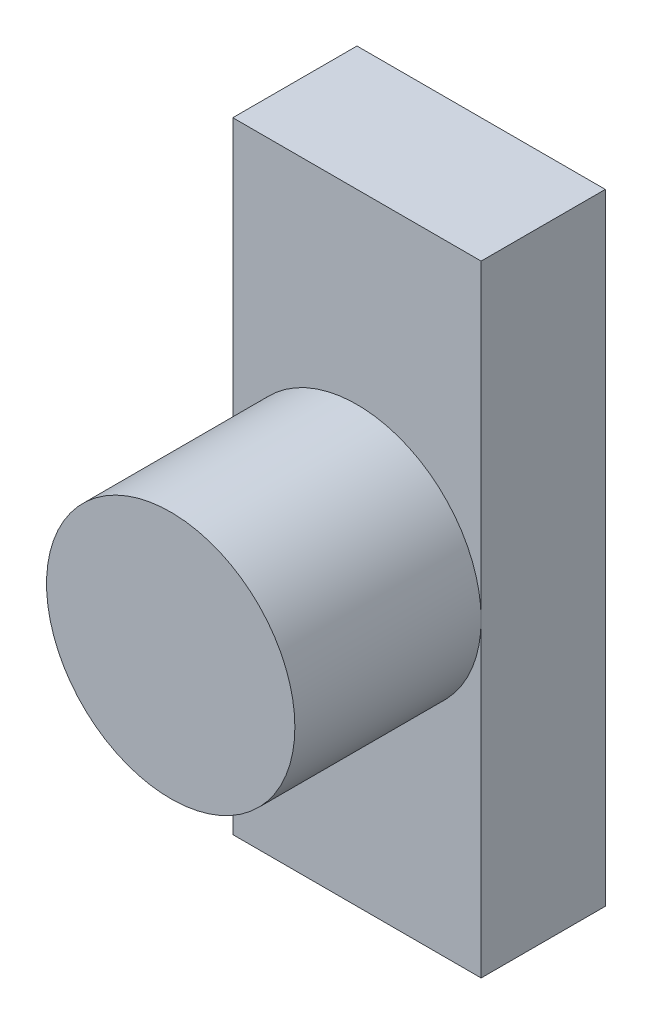
ISO-10303-21;
HEADER;
FILE_DESCRIPTION(('STEP AP214'),'2;1');
FILE_NAME('part.step','',(''),(''),'','','');
FILE_SCHEMA(('AUTOMOTIVE_DESIGN { 1 0 10303 214 1 1 1 1 }'));
ENDSEC;
DATA;
#1=APPLICATION_CONTEXT('core data for automotive mechanical design processes');
#2=APPLICATION_PROTOCOL_DEFINITION('international standard','automotive_design',2000,#1);
#3=PRODUCT_CONTEXT('',#1,'mechanical');
#4=PRODUCT('Part','Part','',(#3));
#5=PRODUCT_RELATED_PRODUCT_CATEGORY('part','',(#4));
#6=PRODUCT_DEFINITION_FORMATION('','',#4);
#7=PRODUCT_DEFINITION_CONTEXT('part definition',#1,'design');
#8=PRODUCT_DEFINITION('design','',#6,#7);
#9=PRODUCT_DEFINITION_SHAPE('','',#8);
#10=(LENGTH_UNIT() NAMED_UNIT(*) SI_UNIT(.MILLI.,.METRE.));
#11=(NAMED_UNIT(*) PLANE_ANGLE_UNIT() SI_UNIT($,.RADIAN.));
#12=(NAMED_UNIT(*) SI_UNIT($,.STERADIAN.) SOLID_ANGLE_UNIT());
#13=UNCERTAINTY_MEASURE_WITH_UNIT(LENGTH_MEASURE(1.E-05),#10,'distance_accuracy_value','');
#14=(GEOMETRIC_REPRESENTATION_CONTEXT(3) GLOBAL_UNCERTAINTY_ASSIGNED_CONTEXT((#13)) GLOBAL_UNIT_ASSIGNED_CONTEXT((#10,
#11,#12)) REPRESENTATION_CONTEXT('',''));
#15=CARTESIAN_POINT('',(0.,0.,0.));
#16=DIRECTION('',(0.,0.,1.));
#17=DIRECTION('',(1.,0.,0.));
#18=AXIS2_PLACEMENT_3D('',#15,#16,#17);
#19=CARTESIAN_POINT('',(0.,0.,2.));
#20=DIRECTION('',(0.,0.,1.));
#21=DIRECTION('',(1.,0.,0.));
#22=AXIS2_PLACEMENT_3D('',#19,#20,#21);
#23=PLANE('',#22);
#24=CARTESIAN_POINT('',(-2.,5.,2.));
#25=DIRECTION('',(0.,0.,1.));
#26=DIRECTION('',(1.,0.,0.));
#27=AXIS2_PLACEMENT_3D('',#24,#25,#26);
#28=CIRCLE('',#27,2.);
#29=CARTESIAN_POINT('',(0.,5.,2.));
#30=VERTEX_POINT('',#29);
#31=CARTESIAN_POINT('',(-4.,5.,2.));
#32=VERTEX_POINT('',#31);
#33=EDGE_CURVE('E47',#30,#32,#28,.T.);
#34=ORIENTED_EDGE('',*,*,#33,.F.);
#35=DIRECTION('',(0.,1.,0.));
#36=VECTOR('',#35,1.);
#37=CARTESIAN_POINT('',(0.,0.,2.));
#38=LINE('',#37,#36);
#39=CARTESIAN_POINT('',(0.,10.,2.));
#40=VERTEX_POINT('',#39);
#41=EDGE_CURVE('E87',#30,#40,#38,.T.);
#42=ORIENTED_EDGE('',*,*,#41,.T.);
#43=DIRECTION('',(-1.,0.,0.));
#44=VECTOR('',#43,1.);
#45=CARTESIAN_POINT('',(0.,10.,2.));
#46=LINE('',#45,#44);
#47=CARTESIAN_POINT('',(-4.,10.,2.));
#48=VERTEX_POINT('',#47);
#49=EDGE_CURVE('E94',#40,#48,#46,.T.);
#50=ORIENTED_EDGE('',*,*,#49,.T.);
#51=DIRECTION('',(0.,-1.,0.));
#52=VECTOR('',#51,1.);
#53=CARTESIAN_POINT('',(-4.,0.,2.));
#54=LINE('',#53,#52);
#55=EDGE_CURVE('E102',#48,#32,#54,.T.);
#56=ORIENTED_EDGE('',*,*,#55,.T.);
#57=EDGE_LOOP('',(#34,#42,#50,#56));
#58=FACE_BOUND('',#57,.T.);
#59=ADVANCED_FACE('F37',(#58),#23,.T.);
#60=CARTESIAN_POINT('',(0.,0.,2.));
#61=DIRECTION('',(-1.,0.,0.));
#62=DIRECTION('',(0.,0.,1.));
#63=AXIS2_PLACEMENT_3D('',#60,#61,#62);
#64=PLANE('',#63);
#65=DIRECTION('',(0.,1.,0.));
#66=VECTOR('',#65,1.);
#67=CARTESIAN_POINT('',(0.,0.,0.));
#68=LINE('',#67,#66);
#69=CARTESIAN_POINT('',(0.,0.,0.));
#70=VERTEX_POINT('',#69);
#71=CARTESIAN_POINT('',(0.,10.,0.));
#72=VERTEX_POINT('',#71);
#73=EDGE_CURVE('E149',#70,#72,#68,.T.);
#74=ORIENTED_EDGE('',*,*,#73,.T.);
#75=DIRECTION('',(0.,0.,-1.));
#76=VECTOR('',#75,1.);
#77=CARTESIAN_POINT('',(0.,10.,2.));
#78=LINE('',#77,#76);
#79=EDGE_CURVE('E41',#40,#72,#78,.T.);
#80=ORIENTED_EDGE('',*,*,#79,.F.);
#81=ORIENTED_EDGE('',*,*,#41,.F.);
#82=CARTESIAN_POINT('',(0.,0.,2.));
#83=VERTEX_POINT('',#82);
#84=EDGE_CURVE('E91',#83,#30,#38,.T.);
#85=ORIENTED_EDGE('',*,*,#84,.F.);
#86=DIRECTION('',(0.,0.,-1.));
#87=VECTOR('',#86,1.);
#88=CARTESIAN_POINT('',(0.,0.,2.));
#89=LINE('',#88,#87);
#90=EDGE_CURVE('E157',#83,#70,#89,.T.);
#91=ORIENTED_EDGE('',*,*,#90,.T.);
#92=EDGE_LOOP('',(#74,#80,#81,#85,#91));
#93=FACE_BOUND('',#92,.T.);
#94=ADVANCED_FACE('F39',(#93),#64,.F.);
#95=CARTESIAN_POINT('',(0.,10.,2.));
#96=DIRECTION('',(0.,-1.,0.));
#97=DIRECTION('',(0.,0.,-1.));
#98=AXIS2_PLACEMENT_3D('',#95,#96,#97);
#99=PLANE('',#98);
#100=DIRECTION('',(-1.,0.,0.));
#101=VECTOR('',#100,1.);
#102=CARTESIAN_POINT('',(0.,10.,0.));
#103=LINE('',#102,#101);
#104=CARTESIAN_POINT('',(-4.,10.,0.));
#105=VERTEX_POINT('',#104);
#106=EDGE_CURVE('E143',#72,#105,#103,.T.);
#107=ORIENTED_EDGE('',*,*,#106,.T.);
#108=DIRECTION('',(0.,0.,-1.));
#109=VECTOR('',#108,1.);
#110=CARTESIAN_POINT('',(-4.,10.,2.));
#111=LINE('',#110,#109);
#112=EDGE_CURVE('E145',#48,#105,#111,.T.);
#113=ORIENTED_EDGE('',*,*,#112,.F.);
#114=ORIENTED_EDGE('',*,*,#49,.F.);
#115=ORIENTED_EDGE('',*,*,#79,.T.);
#116=EDGE_LOOP('',(#107,#113,#114,#115));
#117=FACE_BOUND('',#116,.T.);
#118=ADVANCED_FACE('F125',(#117),#99,.F.);
#119=CARTESIAN_POINT('',(-4.,0.,2.));
#120=DIRECTION('',(1.,0.,0.));
#121=DIRECTION('',(0.,0.,-1.));
#122=AXIS2_PLACEMENT_3D('',#119,#120,#121);
#123=PLANE('',#122);
#124=DIRECTION('',(0.,-1.,0.));
#125=VECTOR('',#124,1.);
#126=CARTESIAN_POINT('',(-4.,0.,0.));
#127=LINE('',#126,#125);
#128=CARTESIAN_POINT('',(-4.,0.,0.));
#129=VERTEX_POINT('',#128);
#130=EDGE_CURVE('E148',#105,#129,#127,.T.);
#131=ORIENTED_EDGE('',*,*,#130,.T.);
#132=DIRECTION('',(0.,0.,-1.));
#133=VECTOR('',#132,1.);
#134=CARTESIAN_POINT('',(-4.,0.,2.));
#135=LINE('',#134,#133);
#136=CARTESIAN_POINT('',(-4.,0.,2.));
#137=VERTEX_POINT('',#136);
#138=EDGE_CURVE('E152',#137,#129,#135,.T.);
#139=ORIENTED_EDGE('',*,*,#138,.F.);
#140=EDGE_CURVE('E159',#32,#137,#54,.T.);
#141=ORIENTED_EDGE('',*,*,#140,.F.);
#142=ORIENTED_EDGE('',*,*,#55,.F.);
#143=ORIENTED_EDGE('',*,*,#112,.T.);
#144=EDGE_LOOP('',(#131,#139,#141,#142,#143));
#145=FACE_BOUND('',#144,.T.);
#146=ADVANCED_FACE('F131',(#145),#123,.F.);
#147=CARTESIAN_POINT('',(0.,0.,2.));
#148=DIRECTION('',(0.,1.,0.));
#149=DIRECTION('',(-1.,0.,0.));
#150=AXIS2_PLACEMENT_3D('',#147,#148,#149);
#151=PLANE('',#150);
#152=DIRECTION('',(1.,0.,0.));
#153=VECTOR('',#152,1.);
#154=CARTESIAN_POINT('',(0.,0.,0.));
#155=LINE('',#154,#153);
#156=EDGE_CURVE('E79',#129,#70,#155,.T.);
#157=ORIENTED_EDGE('',*,*,#156,.T.);
#158=ORIENTED_EDGE('',*,*,#90,.F.);
#159=DIRECTION('',(1.,0.,0.));
#160=VECTOR('',#159,1.);
#161=CARTESIAN_POINT('',(0.,0.,2.));
#162=LINE('',#161,#160);
#163=EDGE_CURVE('E58',#137,#83,#162,.T.);
#164=ORIENTED_EDGE('',*,*,#163,.F.);
#165=ORIENTED_EDGE('',*,*,#138,.T.);
#166=EDGE_LOOP('',(#157,#158,#164,#165));
#167=FACE_BOUND('',#166,.T.);
#168=ADVANCED_FACE('F127',(#167),#151,.F.);
#169=EDGE_CURVE('E11',#32,#30,#28,.T.);
#170=ORIENTED_EDGE('',*,*,#169,.F.);
#171=ORIENTED_EDGE('',*,*,#140,.T.);
#172=ORIENTED_EDGE('',*,*,#163,.T.);
#173=ORIENTED_EDGE('',*,*,#84,.T.);
#174=EDGE_LOOP('',(#170,#171,#172,#173));
#175=FACE_BOUND('',#174,.T.);
#176=ADVANCED_FACE('F92',(#175),#23,.T.);
#177=CARTESIAN_POINT('',(0.,0.,0.));
#178=DIRECTION('',(0.,0.,1.));
#179=DIRECTION('',(1.,0.,0.));
#180=AXIS2_PLACEMENT_3D('',#177,#178,#179);
#181=PLANE('',#180);
#182=ORIENTED_EDGE('',*,*,#73,.F.);
#183=ORIENTED_EDGE('',*,*,#156,.F.);
#184=ORIENTED_EDGE('',*,*,#130,.F.);
#185=ORIENTED_EDGE('',*,*,#106,.F.);
#186=EDGE_LOOP('',(#182,#183,#184,#185));
#187=FACE_BOUND('',#186,.T.);
#188=ADVANCED_FACE('F108',(#187),#181,.F.);
#189=CARTESIAN_POINT('',(-2.,5.,5.));
#190=DIRECTION('',(0.,0.,-1.));
#191=DIRECTION('',(-1.,0.,0.));
#192=AXIS2_PLACEMENT_3D('',#189,#190,#191);
#193=CYLINDRICAL_SURFACE('',#192,2.);
#194=CARTESIAN_POINT('',(-2.,5.,5.));
#195=DIRECTION('',(0.,0.,1.));
#196=DIRECTION('',(1.,0.,0.));
#197=AXIS2_PLACEMENT_3D('',#194,#195,#196);
#198=CIRCLE('',#197,2.);
#199=CARTESIAN_POINT('',(0.,5.,5.));
#200=VERTEX_POINT('',#199);
#201=EDGE_CURVE('E104',#200,#200,#198,.T.);
#202=ORIENTED_EDGE('',*,*,#201,.F.);
#203=EDGE_LOOP('',(#202));
#204=FACE_BOUND('',#203,.T.);
#205=ORIENTED_EDGE('',*,*,#33,.T.);
#206=ORIENTED_EDGE('',*,*,#169,.T.);
#207=EDGE_LOOP('',(#205,#206));
#208=FACE_BOUND('',#207,.T.);
#209=ADVANCED_FACE('F105',(#204,#208),#193,.T.);
#210=CARTESIAN_POINT('',(-2.,5.,5.));
#211=DIRECTION('',(0.,0.,1.));
#212=DIRECTION('',(1.,0.,0.));
#213=AXIS2_PLACEMENT_3D('',#210,#211,#212);
#214=PLANE('',#213);
#215=ORIENTED_EDGE('',*,*,#201,.T.);
#216=EDGE_LOOP('',(#215));
#217=FACE_BOUND('',#216,.T.);
#218=ADVANCED_FACE('F107',(#217),#214,.T.);
#219=CLOSED_SHELL('',(#59,#94,#118,#146,#168,#176,#188,#209,#218));
#220=MANIFOLD_SOLID_BREP('B2',#219);
#221=ADVANCED_BREP_SHAPE_REPRESENTATION('',(#18,#220),#14);
#222=SHAPE_DEFINITION_REPRESENTATION(#9,#221);
ENDSEC;
END-ISO-10303-21;
